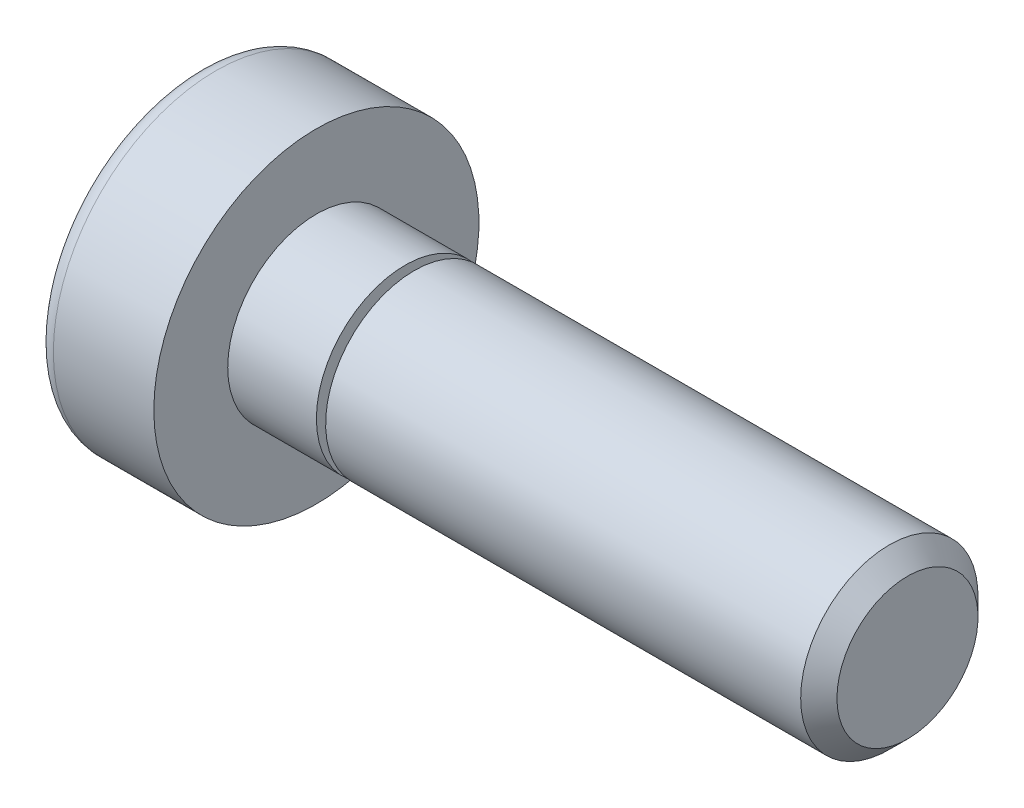
ISO-10303-21;
HEADER;
FILE_DESCRIPTION(('STEP AP214'),'2;1');
FILE_NAME('part.step','',(''),(''),'','','');
FILE_SCHEMA(('AUTOMOTIVE_DESIGN { 1 0 10303 214 1 1 1 1 }'));
ENDSEC;
DATA;
#1=APPLICATION_CONTEXT('core data for automotive mechanical design processes');
#2=APPLICATION_PROTOCOL_DEFINITION('international standard','automotive_design',2000,#1);
#3=PRODUCT_CONTEXT('',#1,'mechanical');
#4=PRODUCT('Part','Part','',(#3));
#5=PRODUCT_RELATED_PRODUCT_CATEGORY('part','',(#4));
#6=PRODUCT_DEFINITION_FORMATION('','',#4);
#7=PRODUCT_DEFINITION_CONTEXT('part definition',#1,'design');
#8=PRODUCT_DEFINITION('design','',#6,#7);
#9=PRODUCT_DEFINITION_SHAPE('','',#8);
#10=(LENGTH_UNIT() NAMED_UNIT(*) SI_UNIT(.MILLI.,.METRE.));
#11=(NAMED_UNIT(*) PLANE_ANGLE_UNIT() SI_UNIT($,.RADIAN.));
#12=(NAMED_UNIT(*) SI_UNIT($,.STERADIAN.) SOLID_ANGLE_UNIT());
#13=UNCERTAINTY_MEASURE_WITH_UNIT(LENGTH_MEASURE(1.E-05),#10,'distance_accuracy_value','');
#14=(GEOMETRIC_REPRESENTATION_CONTEXT(3) GLOBAL_UNCERTAINTY_ASSIGNED_CONTEXT((#13)) GLOBAL_UNIT_ASSIGNED_CONTEXT((#10,
#11,#12)) REPRESENTATION_CONTEXT('',''));
#15=CARTESIAN_POINT('',(0.,0.,0.));
#16=DIRECTION('',(0.,0.,1.));
#17=DIRECTION('',(1.,0.,0.));
#18=AXIS2_PLACEMENT_3D('',#15,#16,#17);
#19=CARTESIAN_POINT('',(10.,0.596637499999982,0.));
#20=DIRECTION('',(1.,0.,0.));
#21=DIRECTION('',(0.,0.,-1.));
#22=AXIS2_PLACEMENT_3D('',#19,#20,#21);
#23=PLANE('',#22);
#24=CARTESIAN_POINT('',(10.0000000001614,0.,0.));
#25=DIRECTION('',(-1.,0.,0.));
#26=DIRECTION('',(0.,0.,1.));
#27=AXIS2_PLACEMENT_3D('',#24,#25,#26);
#28=CIRCLE('',#27,1.193275000162);
#29=CARTESIAN_POINT('',(10.0000000001614,0.,1.193275000162));
#30=VERTEX_POINT('',#29);
#31=EDGE_CURVE('E20',#30,#30,#28,.T.);
#32=ORIENTED_EDGE('',*,*,#31,.F.);
#33=EDGE_LOOP('',(#32));
#34=FACE_BOUND('',#33,.T.);
#35=ADVANCED_FACE('F16',(#34),#23,.T.);
#36=CARTESIAN_POINT('',(-0.504001038052593,0.,0.));
#37=DIRECTION('',(-1.,0.,0.));
#38=DIRECTION('',(0.,0.,1.));
#39=AXIS2_PLACEMENT_3D('',#36,#37,#38);
#40=CONICAL_SURFACE('',#39,1.16192999956868,1.04719754997475);
#41=CARTESIAN_POINT('',(-0.50000000075029,1.00000000017093,0.577948959467397));
#42=CARTESIAN_POINT('',(-0.48629237382386,1.00000000006138,0.530505986138768));
#43=CARTESIAN_POINT('',(-0.473741747990582,1.00000000001644,0.482687327239862));
#44=CARTESIAN_POINT('',(-0.451558908349822,0.999999999983497,0.386271956554048));
#45=CARTESIAN_POINT('',(-0.44193324759536,0.999999999995618,0.337673750815842));
#46=CARTESIAN_POINT('',(-0.426453805314798,1.00000000000426,0.241023607051425));
#47=CARTESIAN_POINT('',(-0.420517364499986,1.00000000000113,0.192985324559301));
#48=CARTESIAN_POINT('',(-0.412547942401927,0.999999999998846,0.0966311212845586));
#49=CARTESIAN_POINT('',(-0.41051070894798,0.999999999999682,0.0483155606396564));
#50=CARTESIAN_POINT('',(-0.410510708947904,1.00000000000029,-0.0483155606516336));
#51=CARTESIAN_POINT('',(-0.412547942401888,1.00000000000007,-0.0966311212980216));
#52=CARTESIAN_POINT('',(-0.42051736450243,0.999999999999905,-0.192985324574892));
#53=CARTESIAN_POINT('',(-0.42645380531968,0.999999999999964,-0.241023607067658));
#54=CARTESIAN_POINT('',(-0.441933247596229,1.00000000000001,-0.337673750835855));
#55=CARTESIAN_POINT('',(-0.451558908344039,1.,-0.386271956577252));
#56=CARTESIAN_POINT('',(-0.473741748006515,0.999999999999976,-0.482687327260879));
#57=CARTESIAN_POINT('',(-0.486292373868118,0.999999999999964,-0.530505986154419));
#58=CARTESIAN_POINT('',(-0.500000000862228,0.999999999999988,-0.577948959467407));
#59=B_SPLINE_CURVE_WITH_KNOTS('',3,(#41,#42,#43,#44,#45,#46,#47,#48,#49,#50,#51,#52,#53,#54,#55,
#56,#57,#58),.UNSPECIFIED.,.F.,.F.,(4,2,2,2,2,2,2,2,4),(0.,0.148196356176735,0.296722322329047,
0.44178762553006,0.586694641515675,0.731601657505277,0.876666960709908,1.02519292686637,
1.17338928304892),.UNSPECIFIED.);
#60=CARTESIAN_POINT('',(-0.500000000889303,0.9999999998933,0.577948959745722));
#61=VERTEX_POINT('',#60);
#62=CARTESIAN_POINT('',(-0.500000000853678,0.999999999893292,-0.577948959622423));
#63=VERTEX_POINT('',#62);
#64=EDGE_CURVE('E88',#61,#63,#59,.T.);
#65=ORIENTED_EDGE('',*,*,#64,.T.);
#66=CARTESIAN_POINT('',(-0.500000000750464,0.999999999897836,-0.577948959940425));
#67=CARTESIAN_POINT('',(-0.485349172417987,0.956037643373577,-0.603317483381026));
#68=CARTESIAN_POINT('',(-0.472026094856608,0.911695794901883,-0.628904993119268));
#69=CARTESIAN_POINT('',(-0.448773550966531,0.822244705373564,-0.680522837350934));
#70=CARTESIAN_POINT('',(-0.438852305303098,0.777133878102894,-0.706554087170983));
#71=CARTESIAN_POINT('',(-0.423412574947941,0.687471128207105,-0.758294070285883));
#72=CARTESIAN_POINT('',(-0.417791260614098,0.642932979666769,-0.783994855231221));
#73=CARTESIAN_POINT('',(-0.411087723114958,0.55364773953878,-0.835516995929307));
#74=CARTESIAN_POINT('',(-0.409999941275023,0.508900971214076,-0.86133816514283));
#75=CARTESIAN_POINT('',(-0.41229591450611,0.425330610917059,-0.909562528492407));
#76=CARTESIAN_POINT('',(-0.415115940411406,0.386494336443703,-0.931973041079041));
#77=CARTESIAN_POINT('',(-0.424043518593614,0.309074734851168,-0.976648102718697));
#78=CARTESIAN_POINT('',(-0.430154103428242,0.270491674344854,-0.998912497922489));
#79=CARTESIAN_POINT('',(-0.445426060622693,0.19291320262915,-1.04367923573219));
#80=CARTESIAN_POINT('',(-0.454651995831515,0.153927580990878,-1.06617592925591));
#81=CARTESIAN_POINT('',(-0.475589692626233,0.0765368941895256,-1.11083430558536));
#82=CARTESIAN_POINT('',(-0.487296553168151,0.0381308420256304,-1.13299655794095));
#83=CARTESIAN_POINT('',(-0.500000000861591,1.89814787464045E-10,-1.15499999989045));
#84=B_SPLINE_CURVE_WITH_KNOTS('',3,(#66,#67,#68,#69,#70,#71,#72,#73,#74,#75,#76,#77,#78,#79,#80,
#81,#82,#83),.UNSPECIFIED.,.F.,.F.,(4,2,2,2,2,2,2,2,4),(0.,0.158549163495099,0.317478810929082,
0.472477440453193,0.627285966368247,0.761939339569063,0.896717021353835,1.0344793450277,
1.17197201605907),.UNSPECIFIED.);
#85=CARTESIAN_POINT('',(-0.500000000853747,0.,-1.15499999987687));
#86=VERTEX_POINT('',#85);
#87=EDGE_CURVE('E116',#63,#86,#84,.T.);
#88=ORIENTED_EDGE('',*,*,#87,.T.);
#89=CARTESIAN_POINT('',(-0.500000000750449,-2.73026198863905E-10,-1.15500000003979));
#90=CARTESIAN_POINT('',(-0.485349172417975,-0.043962356687794,-1.12963147640945));
#91=CARTESIAN_POINT('',(-0.472026094856597,-0.0883042051145717,-1.10404396659337));
#92=CARTESIAN_POINT('',(-0.448773550966522,-0.177755294609957,-1.05242612230464));
#93=CARTESIAN_POINT('',(-0.43885230530309,-0.222866121892747,-1.02639487250559));
#94=CARTESIAN_POINT('',(-0.423412574947934,-0.312528871797154,-0.974654889405634));
#95=CARTESIAN_POINT('',(-0.41779126061409,-0.357067020334369,-0.948954104454888));
#96=CARTESIAN_POINT('',(-0.411087723114951,-0.446352260460088,-0.897431963752873));
#97=CARTESIAN_POINT('',(-0.409999941275016,-0.49109902878564,-0.871610794540822));
#98=CARTESIAN_POINT('',(-0.412295914506104,-0.574669389083187,-0.823386431192165));
#99=CARTESIAN_POINT('',(-0.4151159404114,-0.613505663556364,-0.800975918605219));
#100=CARTESIAN_POINT('',(-0.424043518593608,-0.690925265148767,-0.756300856965331));
#101=CARTESIAN_POINT('',(-0.430154103428237,-0.729508325655129,-0.73403646176162));
#102=CARTESIAN_POINT('',(-0.445426060622688,-0.807086797370873,-0.689269723951982));
#103=CARTESIAN_POINT('',(-0.454651995831512,-0.846072419009135,-0.666773030428251));
#104=CARTESIAN_POINT('',(-0.47558969262623,-0.923463105810469,-0.622114654098761));
#105=CARTESIAN_POINT('',(-0.487296553168149,-0.961869157974355,-0.599952401743155));
#106=CARTESIAN_POINT('',(-0.500000000861589,-0.999999999810191,-0.57794895979369));
#107=B_SPLINE_CURVE_WITH_KNOTS('',3,(#89,#90,#91,#92,#93,#94,#95,#96,#97,#98,#99,#100,#101,#102,
#103,#104,#105,#106),.UNSPECIFIED.,.F.,.F.,(4,2,2,2,2,2,2,2,4),(0.,0.158549163495095,
0.317478810929075,0.472477440453182,0.627285966368233,0.761939339569052,0.896717021353825,
1.03447934502769,1.17197201605906),.UNSPECIFIED.);
#108=CARTESIAN_POINT('',(-0.50000000085366,-0.99999999989333,-0.577948959622392));
#109=VERTEX_POINT('',#108);
#110=EDGE_CURVE('E146',#86,#109,#107,.T.);
#111=ORIENTED_EDGE('',*,*,#110,.T.);
#112=CARTESIAN_POINT('',(-0.500000000750238,-1.00000000017095,-0.577948959467375));
#113=CARTESIAN_POINT('',(-0.486292373823819,-1.00000000006139,-0.530505986138745));
#114=CARTESIAN_POINT('',(-0.473741747990546,-1.00000000001644,-0.48268732723984));
#115=CARTESIAN_POINT('',(-0.45155890834979,-0.999999999983495,-0.386271956554031));
#116=CARTESIAN_POINT('',(-0.441933247595326,-0.999999999995617,-0.337673750815828));
#117=CARTESIAN_POINT('',(-0.426453805314764,-1.00000000000426,-0.241023607051415));
#118=CARTESIAN_POINT('',(-0.420517364499953,-1.00000000000113,-0.192985324559293));
#119=CARTESIAN_POINT('',(-0.412547942401894,-0.999999999998846,-0.0966311212845551));
#120=CARTESIAN_POINT('',(-0.410510708947947,-0.999999999999682,-0.0483155606396551));
#121=CARTESIAN_POINT('',(-0.410510708947871,-1.00000000000029,0.0483155606516283));
#122=CARTESIAN_POINT('',(-0.412547942401855,-1.00000000000007,0.0966311212980118));
#123=CARTESIAN_POINT('',(-0.420517364502396,-0.999999999999905,0.192985324574873));
#124=CARTESIAN_POINT('',(-0.426453805319645,-0.999999999999964,0.241023607067635));
#125=CARTESIAN_POINT('',(-0.441933247596193,-1.00000000000001,0.337673750835823));
#126=CARTESIAN_POINT('',(-0.451558908344001,-1.,0.386271956577215));
#127=CARTESIAN_POINT('',(-0.473741748006474,-0.999999999999976,0.482687327260833));
#128=CARTESIAN_POINT('',(-0.486292373868075,-0.999999999999964,0.530505986154369));
#129=CARTESIAN_POINT('',(-0.500000000862184,-0.999999999999988,0.577948959467352));
#130=B_SPLINE_CURVE_WITH_KNOTS('',3,(#112,#113,#114,#115,#116,#117,#118,#119,#120,#121,#122,
#123,#124,#125,#126,#127,#128,#129),.UNSPECIFIED.,.F.,.F.,(4,2,2,2,2,2,2,2,4),(0.,
0.148196356176728,0.296722322329032,0.441787625530039,0.586694641515648,0.731601657505236,
0.876666960709854,1.0251929268663,1.17338928304884),.UNSPECIFIED.);
#131=CARTESIAN_POINT('',(-0.500000000853652,-0.999999999893325,0.577948959622376));
#132=VERTEX_POINT('',#131);
#133=EDGE_CURVE('E141',#109,#132,#130,.T.);
#134=ORIENTED_EDGE('',*,*,#133,.T.);
#135=CARTESIAN_POINT('',(-0.500000000750473,-0.999999999897884,0.577948959940368));
#136=CARTESIAN_POINT('',(-0.485349172417985,-0.956037643373636,0.603317483380982));
#137=CARTESIAN_POINT('',(-0.4720260948566,-0.911695794901945,0.628904993119229));
#138=CARTESIAN_POINT('',(-0.448773550966519,-0.822244705373628,0.6805228373509));
#139=CARTESIAN_POINT('',(-0.438852305303086,-0.777133878102956,0.706554087170948));
#140=CARTESIAN_POINT('',(-0.423412574947928,-0.687471128207166,0.758294070285848));
#141=CARTESIAN_POINT('',(-0.417791260614084,-0.642932979666829,0.783994855231186));
#142=CARTESIAN_POINT('',(-0.411087723114942,-0.55364773953884,0.835516995929273));
#143=CARTESIAN_POINT('',(-0.409999941275006,-0.508900971214135,0.861338165142796));
#144=CARTESIAN_POINT('',(-0.412295914506093,-0.425330610917115,0.909562528492374));
#145=CARTESIAN_POINT('',(-0.415115940411389,-0.386494336443757,0.931973041079009));
#146=CARTESIAN_POINT('',(-0.424043518593597,-0.309074734851218,0.976648102718668));
#147=CARTESIAN_POINT('',(-0.430154103428226,-0.270491674344901,0.998912497922462));
#148=CARTESIAN_POINT('',(-0.445426060622677,-0.192913202629193,1.04367923573217));
#149=CARTESIAN_POINT('',(-0.454651995831501,-0.153927580990918,1.06617592925588));
#150=CARTESIAN_POINT('',(-0.475589692626221,-0.0765368941895602,1.11083430558534));
#151=CARTESIAN_POINT('',(-0.48729655316814,-0.0381308420256624,1.13299655794093));
#152=CARTESIAN_POINT('',(-0.500000000861581,-1.89844400923488E-10,1.15499999989043));
#153=B_SPLINE_CURVE_WITH_KNOTS('',3,(#135,#136,#137,#138,#139,#140,#141,#142,#143,#144,#145,
#146,#147,#148,#149,#150,#151,#152),.UNSPECIFIED.,.F.,.F.,(4,2,2,2,2,2,2,2,4),(0.,
0.158549163495102,0.317478810929088,0.4724774404532,0.627285966368255,0.76193933956908,
0.896717021353859,1.03447934502773,1.17197201605911),.UNSPECIFIED.);
#154=CARTESIAN_POINT('',(-0.500000000853747,0.,1.15499999987686));
#155=VERTEX_POINT('',#154);
#156=EDGE_CURVE('E91',#132,#155,#153,.T.);
#157=ORIENTED_EDGE('',*,*,#156,.T.);
#158=CARTESIAN_POINT('',(-0.500000000750466,2.72993235255291E-10,1.1550000000398));
#159=CARTESIAN_POINT('',(-0.485349172417988,0.0439623566877654,1.12963147640946));
#160=CARTESIAN_POINT('',(-0.472026094856608,0.0883042051145458,1.10404396659338));
#161=CARTESIAN_POINT('',(-0.448773550966532,0.177755294609934,1.05242612230465));
#162=CARTESIAN_POINT('',(-0.438852305303101,0.222866121892726,1.02639487250561));
#163=CARTESIAN_POINT('',(-0.423412574947947,0.312528871797135,0.974654889405645));
#164=CARTESIAN_POINT('',(-0.417791260614104,0.357067020334351,0.948954104454898));
#165=CARTESIAN_POINT('',(-0.411087723114966,0.446352260460072,0.897431963752882));
#166=CARTESIAN_POINT('',(-0.409999941275032,0.491099028785625,0.87161079454083));
#167=CARTESIAN_POINT('',(-0.412295914506122,0.574669389083171,0.823386431192175));
#168=CARTESIAN_POINT('',(-0.415115940411418,0.613505663556343,0.800975918605231));
#169=CARTESIAN_POINT('',(-0.424043518593627,0.690925265148738,0.756300856965347));
#170=CARTESIAN_POINT('',(-0.430154103428255,0.729508325655096,0.734036461761639));
#171=CARTESIAN_POINT('',(-0.445426060622704,0.807086797370832,0.689269723952005));
#172=CARTESIAN_POINT('',(-0.454651995831527,0.846072419009092,0.666773030428277));
#173=CARTESIAN_POINT('',(-0.475589692626243,0.923463105810418,0.622114654098791));
#174=CARTESIAN_POINT('',(-0.48729655316816,0.961869157974301,0.599952401743187));
#175=CARTESIAN_POINT('',(-0.500000000861598,0.999999999810133,0.577948959793723));
#176=B_SPLINE_CURVE_WITH_KNOTS('',3,(#158,#159,#160,#161,#162,#163,#164,#165,#166,#167,#168,
#169,#170,#171,#172,#173,#174,#175),.UNSPECIFIED.,.F.,.F.,(4,2,2,2,2,2,2,2,4),(0.,
0.1585491634951,0.317478810929084,0.472477440453195,0.627285966368249,0.761939339569055,
0.896717021353815,1.03447934502767,1.17197201605903),.UNSPECIFIED.);
#177=EDGE_CURVE('E61',#155,#61,#176,.T.);
#178=ORIENTED_EDGE('',*,*,#177,.T.);
#179=EDGE_LOOP('',(#65,#88,#111,#134,#157,#178));
#180=FACE_BOUND('',#179,.T.);
#181=CARTESIAN_POINT('',(0.166839561870802,-1.13686837721616E-10,0.));
#182=VERTEX_POINT('',#181);
#183=VERTEX_LOOP('',#182);
#184=FACE_BOUND('',#183,.T.);
#185=ADVANCED_FACE('F85',(#180,#184),#40,.F.);
#186=CARTESIAN_POINT('',(9.69327499996098,0.,0.));
#187=DIRECTION('',(-1.,0.,0.));
#188=DIRECTION('',(0.,0.,1.));
#189=AXIS2_PLACEMENT_3D('',#186,#187,#188);
#190=CONICAL_SURFACE('',#189,1.49999999979403,0.78539816247083);
#191=CARTESIAN_POINT('',(9.69327500000008,0.,0.));
#192=DIRECTION('',(-1.,0.,0.));
#193=DIRECTION('',(0.,1.,0.));
#194=AXIS2_PLACEMENT_3D('',#191,#192,#193);
#195=CIRCLE('',#194,1.49999999999999);
#196=CARTESIAN_POINT('',(9.69327500000008,1.49999999999997,0.));
#197=VERTEX_POINT('',#196);
#198=EDGE_CURVE('E103',#197,#197,#195,.T.);
#199=ORIENTED_EDGE('',*,*,#198,.F.);
#200=EDGE_LOOP('',(#199));
#201=FACE_BOUND('',#200,.T.);
#202=ORIENTED_EDGE('',*,*,#31,.T.);
#203=EDGE_LOOP('',(#202));
#204=FACE_BOUND('',#203,.T.);
#205=ADVANCED_FACE('F128',(#201,#204),#190,.T.);
#206=CARTESIAN_POINT('',(-2.,0.,1.155));
#207=DIRECTION('',(0.,0.499805607369879,0.86613760733594));
#208=DIRECTION('',(0.,-0.86613760733594,0.499805607369879));
#209=AXIS2_PLACEMENT_3D('',#206,#207,#208);
#210=PLANE('',#209);
#211=DIRECTION('',(1.,0.,0.));
#212=VECTOR('',#211,1.);
#213=CARTESIAN_POINT('',(-2.,0.,1.15500000000001));
#214=LINE('',#213,#212);
#215=CARTESIAN_POINT('',(-2.,0.,1.155));
#216=VERTEX_POINT('',#215);
#217=EDGE_CURVE('E93',#155,#216,#214,.F.);
#218=ORIENTED_EDGE('',*,*,#217,.T.);
#219=DIRECTION('',(0.,-0.866137607335932,0.499805607369892));
#220=VECTOR('',#219,1.);
#221=CARTESIAN_POINT('',(-2.,0.999999999999988,0.577948959684148));
#222=LINE('',#221,#220);
#223=CARTESIAN_POINT('',(-2.,0.999999999999988,0.577948959684148));
#224=VERTEX_POINT('',#223);
#225=EDGE_CURVE('E82',#224,#216,#222,.T.);
#226=ORIENTED_EDGE('',*,*,#225,.F.);
#227=DIRECTION('',(1.,0.,0.));
#228=VECTOR('',#227,1.);
#229=CARTESIAN_POINT('',(-2.,0.999999999999988,0.577948959684148));
#230=LINE('',#229,#228);
#231=EDGE_CURVE('E94',#224,#61,#230,.T.);
#232=ORIENTED_EDGE('',*,*,#231,.T.);
#233=ORIENTED_EDGE('',*,*,#177,.F.);
#234=EDGE_LOOP('',(#218,#226,#232,#233));
#235=FACE_BOUND('',#234,.T.);
#236=ADVANCED_FACE('F95',(#235),#210,.F.);
#237=CARTESIAN_POINT('',(-2.,-0.999999999999988,0.577948959684148));
#238=DIRECTION('',(0.,-0.499805607369879,0.86613760733594));
#239=DIRECTION('',(0.,-0.86613760733594,-0.499805607369879));
#240=AXIS2_PLACEMENT_3D('',#237,#238,#239);
#241=PLANE('',#240);
#242=DIRECTION('',(1.,0.,0.));
#243=VECTOR('',#242,1.);
#244=CARTESIAN_POINT('',(-2.,-0.999999999999988,0.577948959684097));
#245=LINE('',#244,#243);
#246=CARTESIAN_POINT('',(-2.,-0.999999999999988,0.577948959684116));
#247=VERTEX_POINT('',#246);
#248=EDGE_CURVE('E264',#132,#247,#245,.F.);
#249=ORIENTED_EDGE('',*,*,#248,.T.);
#250=DIRECTION('',(0.,-0.866137607335932,-0.499805607369892));
#251=VECTOR('',#250,1.);
#252=CARTESIAN_POINT('',(-2.,0.,1.155));
#253=LINE('',#252,#251);
#254=EDGE_CURVE('E227',#216,#247,#253,.T.);
#255=ORIENTED_EDGE('',*,*,#254,.F.);
#256=ORIENTED_EDGE('',*,*,#217,.F.);
#257=ORIENTED_EDGE('',*,*,#156,.F.);
#258=EDGE_LOOP('',(#249,#255,#256,#257));
#259=FACE_BOUND('',#258,.T.);
#260=ADVANCED_FACE('F262',(#259),#241,.F.);
#261=CARTESIAN_POINT('',(-2.,-0.999999999999988,-0.577948959684148));
#262=DIRECTION('',(0.,-1.,0.));
#263=DIRECTION('',(0.,0.,-1.));
#264=AXIS2_PLACEMENT_3D('',#261,#262,#263);
#265=PLANE('',#264);
#266=DIRECTION('',(1.,0.,0.));
#267=VECTOR('',#266,1.);
#268=CARTESIAN_POINT('',(-2.,-1.00000000000008,-0.577948959684112));
#269=LINE('',#268,#267);
#270=CARTESIAN_POINT('',(-2.,-1.00000000000005,-0.577948959684124));
#271=VERTEX_POINT('',#270);
#272=EDGE_CURVE('E153',#109,#271,#269,.F.);
#273=ORIENTED_EDGE('',*,*,#272,.T.);
#274=DIRECTION('',(0.,0.,1.));
#275=VECTOR('',#274,1.);
#276=CARTESIAN_POINT('',(-2.,-0.999999999999988,0.));
#277=LINE('',#276,#275);
#278=EDGE_CURVE('E241',#247,#271,#277,.F.);
#279=ORIENTED_EDGE('',*,*,#278,.F.);
#280=ORIENTED_EDGE('',*,*,#248,.F.);
#281=ORIENTED_EDGE('',*,*,#133,.F.);
#282=EDGE_LOOP('',(#273,#279,#280,#281));
#283=FACE_BOUND('',#282,.T.);
#284=ADVANCED_FACE('F158',(#283),#265,.F.);
#285=CARTESIAN_POINT('',(-2.,0.,-1.155));
#286=DIRECTION('',(0.,-0.499805607369879,-0.86613760733594));
#287=DIRECTION('',(0.,0.86613760733594,-0.499805607369879));
#288=AXIS2_PLACEMENT_3D('',#285,#286,#287);
#289=PLANE('',#288);
#290=DIRECTION('',(1.,0.,0.));
#291=VECTOR('',#290,1.);
#292=CARTESIAN_POINT('',(-2.,0.,-1.15500000000002));
#293=LINE('',#292,#291);
#294=CARTESIAN_POINT('',(-2.,0.,-1.15500000000001));
#295=VERTEX_POINT('',#294);
#296=EDGE_CURVE('E152',#86,#295,#293,.F.);
#297=ORIENTED_EDGE('',*,*,#296,.T.);
#298=DIRECTION('',(0.,0.866137607335932,-0.499805607369892));
#299=VECTOR('',#298,1.);
#300=CARTESIAN_POINT('',(-2.,-0.999999999999988,-0.577948959684148));
#301=LINE('',#300,#299);
#302=EDGE_CURVE('E236',#271,#295,#301,.T.);
#303=ORIENTED_EDGE('',*,*,#302,.F.);
#304=ORIENTED_EDGE('',*,*,#272,.F.);
#305=ORIENTED_EDGE('',*,*,#110,.F.);
#306=EDGE_LOOP('',(#297,#303,#304,#305));
#307=FACE_BOUND('',#306,.T.);
#308=ADVANCED_FACE('F154',(#307),#289,.F.);
#309=CARTESIAN_POINT('',(-2.,0.999999999999988,-0.577948959684148));
#310=DIRECTION('',(0.,0.499805607369879,-0.86613760733594));
#311=DIRECTION('',(0.,0.86613760733594,0.499805607369879));
#312=AXIS2_PLACEMENT_3D('',#309,#310,#311);
#313=PLANE('',#312);
#314=DIRECTION('',(1.,0.,0.));
#315=VECTOR('',#314,1.);
#316=CARTESIAN_POINT('',(-2.,0.999999999999988,-0.577948959684173));
#317=LINE('',#316,#315);
#318=CARTESIAN_POINT('',(-2.,0.999999999999988,-0.577948959684164));
#319=VERTEX_POINT('',#318);
#320=EDGE_CURVE('E99',#63,#319,#317,.F.);
#321=ORIENTED_EDGE('',*,*,#320,.T.);
#322=DIRECTION('',(0.,0.866137607335932,0.499805607369892));
#323=VECTOR('',#322,1.);
#324=CARTESIAN_POINT('',(-2.,0.,-1.155));
#325=LINE('',#324,#323);
#326=EDGE_CURVE('E231',#295,#319,#325,.T.);
#327=ORIENTED_EDGE('',*,*,#326,.F.);
#328=ORIENTED_EDGE('',*,*,#296,.F.);
#329=ORIENTED_EDGE('',*,*,#87,.F.);
#330=EDGE_LOOP('',(#321,#327,#328,#329));
#331=FACE_BOUND('',#330,.T.);
#332=ADVANCED_FACE('F157',(#331),#313,.F.);
#333=CARTESIAN_POINT('',(-2.,0.999999999999988,0.577948959684148));
#334=DIRECTION('',(0.,1.,0.));
#335=DIRECTION('',(0.,0.,1.));
#336=AXIS2_PLACEMENT_3D('',#333,#334,#335);
#337=PLANE('',#336);
#338=ORIENTED_EDGE('',*,*,#231,.F.);
#339=DIRECTION('',(0.,0.,1.));
#340=VECTOR('',#339,1.);
#341=CARTESIAN_POINT('',(-2.,0.999999999999988,0.));
#342=LINE('',#341,#340);
#343=EDGE_CURVE('E224',#319,#224,#342,.T.);
#344=ORIENTED_EDGE('',*,*,#343,.F.);
#345=ORIENTED_EDGE('',*,*,#320,.F.);
#346=ORIENTED_EDGE('',*,*,#64,.F.);
#347=EDGE_LOOP('',(#338,#344,#345,#346));
#348=FACE_BOUND('',#347,.T.);
#349=ADVANCED_FACE('F102',(#348),#337,.F.);
#350=CARTESIAN_POINT('',(9.69327500000008,0.,0.));
#351=DIRECTION('',(-1.,0.,0.));
#352=DIRECTION('',(0.,0.,1.));
#353=AXIS2_PLACEMENT_3D('',#350,#351,#352);
#354=CYLINDRICAL_SURFACE('',#353,1.49999999999999);
#355=CARTESIAN_POINT('',(1.65630773523162,0.,0.));
#356=DIRECTION('',(1.,0.,0.));
#357=DIRECTION('',(0.,1.,0.));
#358=AXIS2_PLACEMENT_3D('',#355,#356,#357);
#359=CIRCLE('',#358,1.49999999990769);
#360=CARTESIAN_POINT('',(1.65630773523162,1.49999999990769,0.));
#361=VERTEX_POINT('',#360);
#362=EDGE_CURVE('E213',#361,#361,#359,.F.);
#363=ORIENTED_EDGE('',*,*,#362,.F.);
#364=EDGE_LOOP('',(#363));
#365=FACE_BOUND('',#364,.T.);
#366=ORIENTED_EDGE('',*,*,#198,.T.);
#367=EDGE_LOOP('',(#366));
#368=FACE_BOUND('',#367,.T.);
#369=ADVANCED_FACE('F168',(#365,#368),#354,.T.);
#370=CARTESIAN_POINT('',(-2.,1.95250000000001,0.));
#371=DIRECTION('',(-1.,0.,0.));
#372=DIRECTION('',(0.,0.,1.));
#373=AXIS2_PLACEMENT_3D('',#370,#371,#372);
#374=PLANE('',#373);
#375=ORIENTED_EDGE('',*,*,#326,.T.);
#376=ORIENTED_EDGE('',*,*,#343,.T.);
#377=ORIENTED_EDGE('',*,*,#225,.T.);
#378=ORIENTED_EDGE('',*,*,#254,.T.);
#379=ORIENTED_EDGE('',*,*,#278,.T.);
#380=ORIENTED_EDGE('',*,*,#302,.T.);
#381=EDGE_LOOP('',(#375,#376,#377,#378,#379,#380));
#382=FACE_BOUND('',#381,.T.);
#383=CARTESIAN_POINT('',(-2.,0.,-2.44999999999998));
#384=CARTESIAN_POINT('',(-2.,-0.467309748428746,-2.44989883647268));
#385=CARTESIAN_POINT('',(-2.,-0.90183203842658,-2.27798133760294));
#386=CARTESIAN_POINT('',(-2.,-1.37316590275571,-2.09149944483633));
#387=CARTESIAN_POINT('',(-2.,-1.73241161390703,-1.73241161390703));
#388=CARTESIAN_POINT('',(-2.,-2.09091197099622,-1.37406880947389));
#389=CARTESIAN_POINT('',(-2.,-2.27798133760293,-0.901832038426582));
#390=CARTESIAN_POINT('',(-2.,-2.44989872063477,-0.467844842540371));
#391=CARTESIAN_POINT('',(-2.,-2.44999999999998,0.));
#392=CARTESIAN_POINT('',(-2.,-2.45010105288375,0.466798645495714));
#393=CARTESIAN_POINT('',(-2.,-2.27798133760294,0.901832038426581));
#394=CARTESIAN_POINT('',(-2.,-2.09149944483577,1.37316590275647));
#395=CARTESIAN_POINT('',(-2.,-1.73241161390703,1.73241161390703));
#396=CARTESIAN_POINT('',(-2.,-1.37406880947355,2.09091197099636));
#397=CARTESIAN_POINT('',(-2.,-0.901832038426582,2.27798133760293));
#398=CARTESIAN_POINT('',(-2.,-0.467844842539406,2.44989872063515));
#399=CARTESIAN_POINT('',(-2.,0.,2.44999999999998));
#400=B_SPLINE_CURVE_WITH_KNOTS('',2,(#383,#384,#385,#386,#387,#388,#389,#390,#391,#392,#393,
#394,#395,#396,#397,#398,#399),.UNSPECIFIED.,.F.,.F.,(3,2,2,2,2,2,2,2,3),(0.,0.125,0.25,0.375,
0.5,0.625,0.75,0.875,1.),.UNSPECIFIED.);
#401=CARTESIAN_POINT('',(-2.,0.,-2.44999999999998));
#402=VERTEX_POINT('',#401);
#403=CARTESIAN_POINT('',(-2.,0.,2.44999999999998));
#404=VERTEX_POINT('',#403);
#405=EDGE_CURVE('E35',#402,#404,#400,.T.);
#406=ORIENTED_EDGE('',*,*,#405,.T.);
#407=CARTESIAN_POINT('',(-2.,0.,2.44999999999998));
#408=CARTESIAN_POINT('',(-2.,0.467309748428887,2.44989883647287));
#409=CARTESIAN_POINT('',(-2.,0.90183203842658,2.27798133760294));
#410=CARTESIAN_POINT('',(-2.,1.37316590275599,2.09149944483595));
#411=CARTESIAN_POINT('',(-2.,1.73241161390703,1.73241161390703));
#412=CARTESIAN_POINT('',(-2.,2.09091197099582,1.3740688094744));
#413=CARTESIAN_POINT('',(-2.,2.27798133760294,0.901832038426581));
#414=CARTESIAN_POINT('',(-2.,2.44989872063534,0.467844842539397));
#415=CARTESIAN_POINT('',(-2.,2.44999999999998,0.));
#416=B_SPLINE_CURVE_WITH_KNOTS('',2,(#407,#408,#409,#410,#411,#412,#413,#414,#415),
.UNSPECIFIED.,.F.,.F.,(3,2,2,2,3),(0.,0.25,0.5,0.75,1.),.UNSPECIFIED.);
#417=CARTESIAN_POINT('',(-2.,2.44999999999998,0.));
#418=VERTEX_POINT('',#417);
#419=EDGE_CURVE('E205',#404,#418,#416,.T.);
#420=ORIENTED_EDGE('',*,*,#419,.T.);
#421=CARTESIAN_POINT('',(-2.,2.44999999999998,0.));
#422=CARTESIAN_POINT('',(-2.,2.44989883647287,-0.467309748428838));
#423=CARTESIAN_POINT('',(-2.,2.27798133760294,-0.901832038426581));
#424=CARTESIAN_POINT('',(-2.,2.09149944483599,-1.37316590275595));
#425=CARTESIAN_POINT('',(-2.,1.73241161390703,-1.73241161390703));
#426=CARTESIAN_POINT('',(-2.,1.37406880947477,-2.09091197099545));
#427=CARTESIAN_POINT('',(-2.,0.901832038426581,-2.27798133760294));
#428=CARTESIAN_POINT('',(-2.,0.467844842540398,-2.44989872063515));
#429=CARTESIAN_POINT('',(-2.,0.,-2.44999999999998));
#430=B_SPLINE_CURVE_WITH_KNOTS('',2,(#421,#422,#423,#424,#425,#426,#427,#428,#429),
.UNSPECIFIED.,.F.,.F.,(3,2,2,2,3),(0.,0.25,0.5,0.75,1.),.UNSPECIFIED.);
#431=EDGE_CURVE('E199',#418,#402,#430,.T.);
#432=ORIENTED_EDGE('',*,*,#431,.T.);
#433=EDGE_LOOP('',(#406,#420,#432));
#434=FACE_BOUND('',#433,.T.);
#435=ADVANCED_FACE('F191',(#382,#434),#374,.T.);
#436=CARTESIAN_POINT('',(1.65630773523162,0.,0.));
#437=DIRECTION('',(1.,0.,0.));
#438=DIRECTION('',(0.,0.,-1.));
#439=AXIS2_PLACEMENT_3D('',#436,#437,#438);
#440=CONICAL_SURFACE('',#439,1.49999999990769,1.0471975499748);
#441=CARTESIAN_POINT('',(1.49999999985084,0.,0.));
#442=DIRECTION('',(1.,0.,0.));
#443=DIRECTION('',(0.,0.,-1.));
#444=AXIS2_PLACEMENT_3D('',#441,#442,#443);
#445=CIRCLE('',#444,1.22926706137605);
#446=CARTESIAN_POINT('',(1.49999999985084,0.,-1.22926706137605));
#447=VERTEX_POINT('',#446);
#448=EDGE_CURVE('E114',#447,#447,#445,.T.);
#449=ORIENTED_EDGE('',*,*,#448,.T.);
#450=EDGE_LOOP('',(#449));
#451=FACE_BOUND('',#450,.T.);
#452=ORIENTED_EDGE('',*,*,#362,.T.);
#453=EDGE_LOOP('',(#452));
#454=FACE_BOUND('',#453,.T.);
#455=ADVANCED_FACE('F188',(#451,#454),#440,.T.);
#456=CARTESIAN_POINT('',(-1.69999999999998,0.,0.));
#457=DIRECTION('',(-1.,0.,0.));
#458=DIRECTION('',(0.,-1.,0.));
#459=AXIS2_PLACEMENT_3D('',#456,#457,#458);
#460=TOROIDAL_SURFACE('',#459,2.44999999999998,0.300000000000019);
#461=CARTESIAN_POINT('',(-1.69999999999998,0.,0.));
#462=DIRECTION('',(-1.,0.,0.));
#463=DIRECTION('',(0.,1.,0.));
#464=AXIS2_PLACEMENT_3D('',#461,#462,#463);
#465=CIRCLE('',#464,2.75000000000002);
#466=CARTESIAN_POINT('',(-1.69999999999998,2.75,0.));
#467=VERTEX_POINT('',#466);
#468=EDGE_CURVE('E214',#467,#467,#465,.F.);
#469=ORIENTED_EDGE('',*,*,#468,.F.);
#470=EDGE_LOOP('',(#469));
#471=FACE_BOUND('',#470,.T.);
#472=ORIENTED_EDGE('',*,*,#419,.F.);
#473=ORIENTED_EDGE('',*,*,#405,.F.);
#474=ORIENTED_EDGE('',*,*,#431,.F.);
#475=EDGE_LOOP('',(#472,#473,#474));
#476=FACE_BOUND('',#475,.T.);
#477=ADVANCED_FACE('F18',(#471,#476),#460,.T.);
#478=CARTESIAN_POINT('',(1.50000000000005,1.3646335306587,0.));
#479=DIRECTION('',(-1.,0.,0.));
#480=DIRECTION('',(0.,0.,1.));
#481=AXIS2_PLACEMENT_3D('',#478,#479,#480);
#482=PLANE('',#481);
#483=ORIENTED_EDGE('',*,*,#448,.F.);
#484=EDGE_LOOP('',(#483));
#485=FACE_BOUND('',#484,.T.);
#486=CARTESIAN_POINT('',(1.50000000000005,0.,0.));
#487=DIRECTION('',(-1.,0.,0.));
#488=DIRECTION('',(0.,0.,1.));
#489=AXIS2_PLACEMENT_3D('',#486,#487,#488);
#490=CIRCLE('',#489,1.49999999999999);
#491=CARTESIAN_POINT('',(1.50000000000005,0.,1.49999999999999));
#492=VERTEX_POINT('',#491);
#493=EDGE_CURVE('E222',#492,#492,#490,.T.);
#494=ORIENTED_EDGE('',*,*,#493,.F.);
#495=EDGE_LOOP('',(#494));
#496=FACE_BOUND('',#495,.T.);
#497=ADVANCED_FACE('F183',(#485,#496),#482,.F.);
#498=CARTESIAN_POINT('',(0.,0.,0.));
#499=DIRECTION('',(-1.,0.,0.));
#500=DIRECTION('',(0.,0.,1.));
#501=AXIS2_PLACEMENT_3D('',#498,#499,#500);
#502=CYLINDRICAL_SURFACE('',#501,2.75000000000002);
#503=ORIENTED_EDGE('',*,*,#468,.T.);
#504=EDGE_LOOP('',(#503));
#505=FACE_BOUND('',#504,.T.);
#506=CARTESIAN_POINT('',(0.,0.,0.));
#507=DIRECTION('',(-1.,0.,0.));
#508=DIRECTION('',(0.,0.,1.));
#509=AXIS2_PLACEMENT_3D('',#506,#507,#508);
#510=CIRCLE('',#509,2.75000000000002);
#511=CARTESIAN_POINT('',(0.,0.,2.75000000000002));
#512=VERTEX_POINT('',#511);
#513=EDGE_CURVE('E26',#512,#512,#510,.F.);
#514=ORIENTED_EDGE('',*,*,#513,.F.);
#515=EDGE_LOOP('',(#514));
#516=FACE_BOUND('',#515,.T.);
#517=ADVANCED_FACE('F176',(#505,#516),#502,.T.);
#518=CARTESIAN_POINT('',(1.50000000000005,0.,0.));
#519=DIRECTION('',(-1.,0.,0.));
#520=DIRECTION('',(0.,0.,1.));
#521=AXIS2_PLACEMENT_3D('',#518,#519,#520);
#522=CYLINDRICAL_SURFACE('',#521,1.49999999999999);
#523=CARTESIAN_POINT('',(0.,0.,0.));
#524=DIRECTION('',(-1.,0.,0.));
#525=DIRECTION('',(0.,0.,1.));
#526=AXIS2_PLACEMENT_3D('',#523,#524,#525);
#527=CIRCLE('',#526,1.49999999999999);
#528=CARTESIAN_POINT('',(0.,0.,1.49999999999999));
#529=VERTEX_POINT('',#528);
#530=EDGE_CURVE('E11',#529,#529,#527,.T.);
#531=ORIENTED_EDGE('',*,*,#530,.F.);
#532=EDGE_LOOP('',(#531));
#533=FACE_BOUND('',#532,.T.);
#534=ORIENTED_EDGE('',*,*,#493,.T.);
#535=EDGE_LOOP('',(#534));
#536=FACE_BOUND('',#535,.T.);
#537=ADVANCED_FACE('F171',(#533,#536),#522,.T.);
#538=CARTESIAN_POINT('',(0.,2.12499999999998,0.));
#539=DIRECTION('',(1.,0.,0.));
#540=DIRECTION('',(0.,0.,-1.));
#541=AXIS2_PLACEMENT_3D('',#538,#539,#540);
#542=PLANE('',#541);
#543=ORIENTED_EDGE('',*,*,#530,.T.);
#544=EDGE_LOOP('',(#543));
#545=FACE_BOUND('',#544,.T.);
#546=ORIENTED_EDGE('',*,*,#513,.T.);
#547=EDGE_LOOP('',(#546));
#548=FACE_BOUND('',#547,.T.);
#549=ADVANCED_FACE('F169',(#545,#548),#542,.T.);
#550=CLOSED_SHELL('',(#35,#185,#205,#236,#260,#284,#308,#332,#349,#369,#435,#455,#477,#497,#517,
#537,#549));
#551=MANIFOLD_SOLID_BREP('B1',#550);
#552=ADVANCED_BREP_SHAPE_REPRESENTATION('',(#18,#551),#14);
#553=SHAPE_DEFINITION_REPRESENTATION(#9,#552);
ENDSEC;
END-ISO-10303-21;
